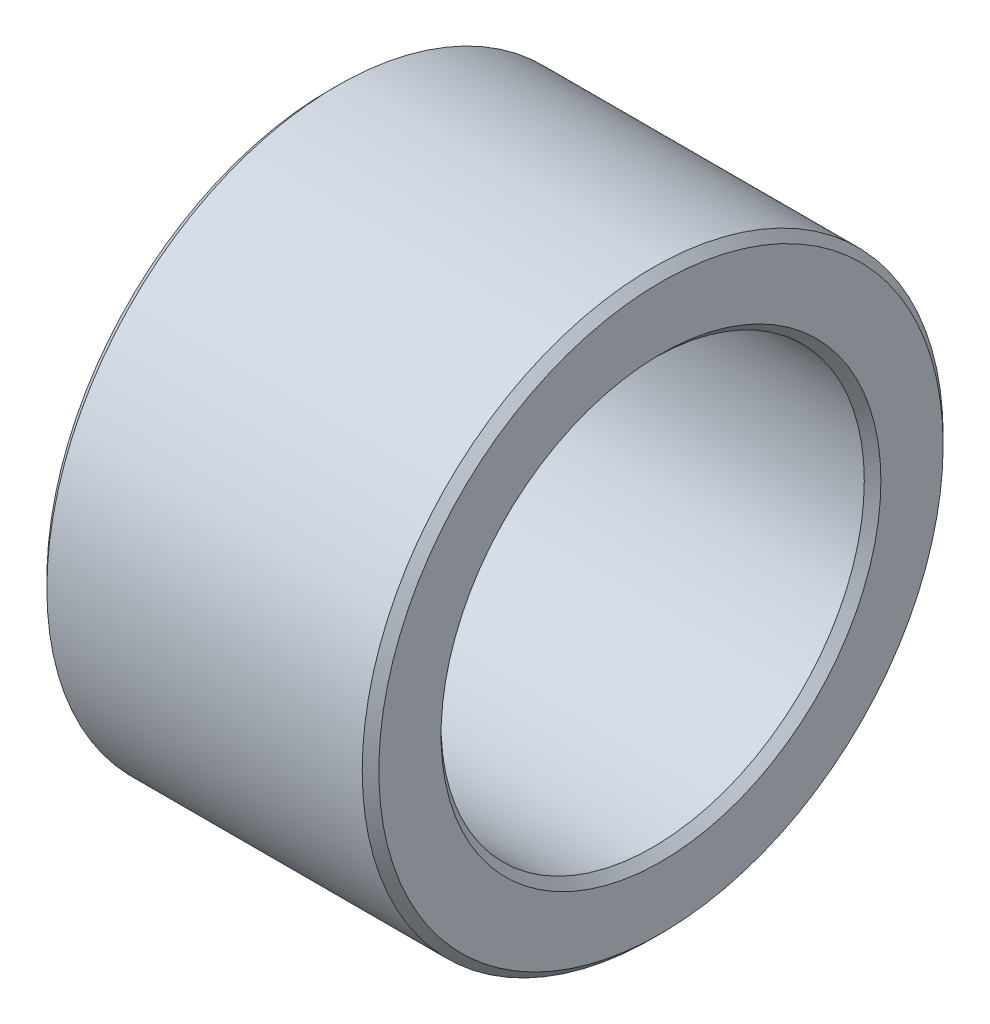
ISO-10303-21;
HEADER;
FILE_DESCRIPTION(('STEP AP214'),'2;1');
FILE_NAME('part.step','',(''),(''),'','','');
FILE_SCHEMA(('AUTOMOTIVE_DESIGN { 1 0 10303 214 1 1 1 1 }'));
ENDSEC;
DATA;
#1=APPLICATION_CONTEXT('core data for automotive mechanical design processes');
#2=APPLICATION_PROTOCOL_DEFINITION('international standard','automotive_design',2000,#1);
#3=PRODUCT_CONTEXT('',#1,'mechanical');
#4=PRODUCT('Part','Part','',(#3));
#5=PRODUCT_RELATED_PRODUCT_CATEGORY('part','',(#4));
#6=PRODUCT_DEFINITION_FORMATION('','',#4);
#7=PRODUCT_DEFINITION_CONTEXT('part definition',#1,'design');
#8=PRODUCT_DEFINITION('design','',#6,#7);
#9=PRODUCT_DEFINITION_SHAPE('','',#8);
#10=(LENGTH_UNIT() NAMED_UNIT(*) SI_UNIT(.MILLI.,.METRE.));
#11=(NAMED_UNIT(*) PLANE_ANGLE_UNIT() SI_UNIT($,.RADIAN.));
#12=(NAMED_UNIT(*) SI_UNIT($,.STERADIAN.) SOLID_ANGLE_UNIT());
#13=UNCERTAINTY_MEASURE_WITH_UNIT(LENGTH_MEASURE(1.E-05),#10,'distance_accuracy_value','');
#14=(GEOMETRIC_REPRESENTATION_CONTEXT(3) GLOBAL_UNCERTAINTY_ASSIGNED_CONTEXT((#13)) GLOBAL_UNIT_ASSIGNED_CONTEXT((#10,
#11,#12)) REPRESENTATION_CONTEXT('',''));
#15=CARTESIAN_POINT('',(0.,0.,0.));
#16=DIRECTION('',(0.,0.,1.));
#17=DIRECTION('',(1.,0.,0.));
#18=AXIS2_PLACEMENT_3D('',#15,#16,#17);
#19=CARTESIAN_POINT('',(4.,0.,0.));
#20=DIRECTION('',(1.,0.,0.));
#21=DIRECTION('',(0.,0.,-1.));
#22=AXIS2_PLACEMENT_3D('',#19,#20,#21);
#23=PLANE('',#22);
#24=CARTESIAN_POINT('',(4.,0.,0.));
#25=DIRECTION('',(1.,0.,0.));
#26=DIRECTION('',(0.,0.,-1.));
#27=AXIS2_PLACEMENT_3D('',#24,#25,#26);
#28=CIRCLE('',#27,2.65);
#29=CARTESIAN_POINT('',(4.,0.,-2.65));
#30=VERTEX_POINT('',#29);
#31=EDGE_CURVE('E64',#30,#30,#28,.F.);
#32=ORIENTED_EDGE('',*,*,#31,.T.);
#33=EDGE_LOOP('',(#32));
#34=FACE_BOUND('',#33,.T.);
#35=CARTESIAN_POINT('',(4.,0.,0.));
#36=DIRECTION('',(1.,0.,0.));
#37=DIRECTION('',(0.,0.,-1.));
#38=AXIS2_PLACEMENT_3D('',#35,#36,#37);
#39=CIRCLE('',#38,3.4);
#40=CARTESIAN_POINT('',(4.,0.,-3.4));
#41=VERTEX_POINT('',#40);
#42=EDGE_CURVE('E67',#41,#41,#39,.T.);
#43=ORIENTED_EDGE('',*,*,#42,.T.);
#44=EDGE_LOOP('',(#43));
#45=FACE_BOUND('',#44,.T.);
#46=ADVANCED_FACE('F43',(#34,#45),#23,.T.);
#47=CARTESIAN_POINT('',(0.,0.,0.));
#48=DIRECTION('',(1.,0.,0.));
#49=DIRECTION('',(0.,0.,-1.));
#50=AXIS2_PLACEMENT_3D('',#47,#48,#49);
#51=PLANE('',#50);
#52=CARTESIAN_POINT('',(0.,0.,0.));
#53=DIRECTION('',(1.,0.,0.));
#54=DIRECTION('',(0.,0.,-1.));
#55=AXIS2_PLACEMENT_3D('',#52,#53,#54);
#56=CIRCLE('',#55,2.65);
#57=CARTESIAN_POINT('',(0.,0.,-2.65));
#58=VERTEX_POINT('',#57);
#59=EDGE_CURVE('E55',#58,#58,#56,.T.);
#60=ORIENTED_EDGE('',*,*,#59,.T.);
#61=EDGE_LOOP('',(#60));
#62=FACE_BOUND('',#61,.T.);
#63=CARTESIAN_POINT('',(0.,0.,0.));
#64=DIRECTION('',(1.,0.,0.));
#65=DIRECTION('',(0.,0.,-1.));
#66=AXIS2_PLACEMENT_3D('',#63,#64,#65);
#67=CIRCLE('',#66,3.4);
#68=CARTESIAN_POINT('',(0.,0.,-3.4));
#69=VERTEX_POINT('',#68);
#70=EDGE_CURVE('E59',#69,#69,#67,.F.);
#71=ORIENTED_EDGE('',*,*,#70,.T.);
#72=EDGE_LOOP('',(#71));
#73=FACE_BOUND('',#72,.T.);
#74=ADVANCED_FACE('F87',(#62,#73),#51,.F.);
#75=CARTESIAN_POINT('',(4.,0.,0.));
#76=DIRECTION('',(-1.,0.,0.));
#77=DIRECTION('',(0.,0.,1.));
#78=AXIS2_PLACEMENT_3D('',#75,#76,#77);
#79=CYLINDRICAL_SURFACE('',#78,3.5);
#80=CARTESIAN_POINT('',(0.100000000000001,0.,0.));
#81=DIRECTION('',(1.,0.,0.));
#82=DIRECTION('',(0.,0.,-1.));
#83=AXIS2_PLACEMENT_3D('',#80,#81,#82);
#84=CIRCLE('',#83,3.5);
#85=CARTESIAN_POINT('',(0.100000000000001,0.,-3.5));
#86=VERTEX_POINT('',#85);
#87=EDGE_CURVE('E10',#86,#86,#84,.T.);
#88=ORIENTED_EDGE('',*,*,#87,.T.);
#89=EDGE_LOOP('',(#88));
#90=FACE_BOUND('',#89,.T.);
#91=CARTESIAN_POINT('',(3.9,0.,0.));
#92=DIRECTION('',(1.,0.,0.));
#93=DIRECTION('',(0.,0.,-1.));
#94=AXIS2_PLACEMENT_3D('',#91,#92,#93);
#95=CIRCLE('',#94,3.5);
#96=CARTESIAN_POINT('',(3.9,0.,-3.5));
#97=VERTEX_POINT('',#96);
#98=EDGE_CURVE('E51',#97,#97,#95,.F.);
#99=ORIENTED_EDGE('',*,*,#98,.T.);
#100=EDGE_LOOP('',(#99));
#101=FACE_BOUND('',#100,.T.);
#102=ADVANCED_FACE('F90',(#90,#101),#79,.T.);
#103=CARTESIAN_POINT('',(4.,0.,0.));
#104=DIRECTION('',(-1.,0.,0.));
#105=DIRECTION('',(0.,0.,1.));
#106=AXIS2_PLACEMENT_3D('',#103,#104,#105);
#107=CYLINDRICAL_SURFACE('',#106,2.55);
#108=CARTESIAN_POINT('',(3.9,0.,0.));
#109=DIRECTION('',(1.,0.,0.));
#110=DIRECTION('',(0.,0.,-1.));
#111=AXIS2_PLACEMENT_3D('',#108,#109,#110);
#112=CIRCLE('',#111,2.55);
#113=CARTESIAN_POINT('',(3.9,0.,-2.55));
#114=VERTEX_POINT('',#113);
#115=EDGE_CURVE('E70',#114,#114,#112,.T.);
#116=ORIENTED_EDGE('',*,*,#115,.T.);
#117=EDGE_LOOP('',(#116));
#118=FACE_BOUND('',#117,.T.);
#119=CARTESIAN_POINT('',(0.1,0.,0.));
#120=DIRECTION('',(1.,0.,0.));
#121=DIRECTION('',(0.,0.,-1.));
#122=AXIS2_PLACEMENT_3D('',#119,#120,#121);
#123=CIRCLE('',#122,2.55);
#124=CARTESIAN_POINT('',(0.1,0.,-2.55));
#125=VERTEX_POINT('',#124);
#126=EDGE_CURVE('E73',#125,#125,#123,.F.);
#127=ORIENTED_EDGE('',*,*,#126,.T.);
#128=EDGE_LOOP('',(#127));
#129=FACE_BOUND('',#128,.T.);
#130=ADVANCED_FACE('F77',(#118,#129),#107,.F.);
#131=CARTESIAN_POINT('',(3.9,0.,0.));
#132=DIRECTION('',(1.,0.,0.));
#133=DIRECTION('',(0.,0.,-1.));
#134=AXIS2_PLACEMENT_3D('',#131,#132,#133);
#135=CONICAL_SURFACE('',#134,2.55,0.785398163397442);
#136=ORIENTED_EDGE('',*,*,#31,.F.);
#137=EDGE_LOOP('',(#136));
#138=FACE_BOUND('',#137,.T.);
#139=ORIENTED_EDGE('',*,*,#115,.F.);
#140=EDGE_LOOP('',(#139));
#141=FACE_BOUND('',#140,.T.);
#142=ADVANCED_FACE('F83',(#138,#141),#135,.F.);
#143=CARTESIAN_POINT('',(0.,0.,0.));
#144=DIRECTION('',(-1.,0.,0.));
#145=DIRECTION('',(0.,0.,1.));
#146=AXIS2_PLACEMENT_3D('',#143,#144,#145);
#147=CONICAL_SURFACE('',#146,2.65,0.785398163397442);
#148=ORIENTED_EDGE('',*,*,#126,.F.);
#149=EDGE_LOOP('',(#148));
#150=FACE_BOUND('',#149,.T.);
#151=ORIENTED_EDGE('',*,*,#59,.F.);
#152=EDGE_LOOP('',(#151));
#153=FACE_BOUND('',#152,.T.);
#154=ADVANCED_FACE('F79',(#150,#153),#147,.F.);
#155=CARTESIAN_POINT('',(0.100000000000001,0.,0.));
#156=DIRECTION('',(1.,0.,0.));
#157=DIRECTION('',(0.,0.,-1.));
#158=AXIS2_PLACEMENT_3D('',#155,#156,#157);
#159=CONICAL_SURFACE('',#158,3.5,0.785398163397453);
#160=ORIENTED_EDGE('',*,*,#70,.F.);
#161=EDGE_LOOP('',(#160));
#162=FACE_BOUND('',#161,.T.);
#163=ORIENTED_EDGE('',*,*,#87,.F.);
#164=EDGE_LOOP('',(#163));
#165=FACE_BOUND('',#164,.T.);
#166=ADVANCED_FACE('F82',(#162,#165),#159,.T.);
#167=CARTESIAN_POINT('',(4.,0.,0.));
#168=DIRECTION('',(-1.,0.,0.));
#169=DIRECTION('',(0.,0.,1.));
#170=AXIS2_PLACEMENT_3D('',#167,#168,#169);
#171=CONICAL_SURFACE('',#170,3.4,0.785398163397446);
#172=ORIENTED_EDGE('',*,*,#98,.F.);
#173=EDGE_LOOP('',(#172));
#174=FACE_BOUND('',#173,.T.);
#175=ORIENTED_EDGE('',*,*,#42,.F.);
#176=EDGE_LOOP('',(#175));
#177=FACE_BOUND('',#176,.T.);
#178=ADVANCED_FACE('F46',(#174,#177),#171,.T.);
#179=CLOSED_SHELL('',(#46,#74,#102,#130,#142,#154,#166,#178));
#180=MANIFOLD_SOLID_BREP('B2',#179);
#181=ADVANCED_BREP_SHAPE_REPRESENTATION('',(#18,#180),#14);
#182=SHAPE_DEFINITION_REPRESENTATION(#9,#181);
ENDSEC;
END-ISO-10303-21;
